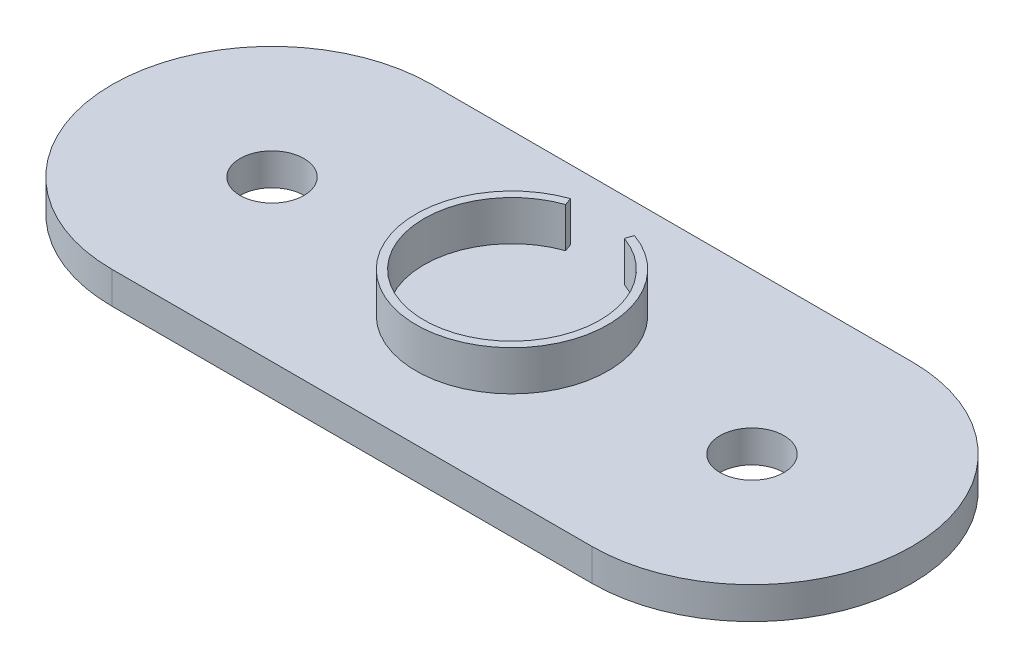
ISO-10303-21;
HEADER;
FILE_DESCRIPTION(('STEP AP214'),'2;1');
FILE_NAME('part.step','',(''),(''),'','','');
FILE_SCHEMA(('AUTOMOTIVE_DESIGN { 1 0 10303 214 1 1 1 1 }'));
ENDSEC;
DATA;
#1=APPLICATION_CONTEXT('core data for automotive mechanical design processes');
#2=APPLICATION_PROTOCOL_DEFINITION('international standard','automotive_design',2000,#1);
#3=PRODUCT_CONTEXT('',#1,'mechanical');
#4=PRODUCT('Part','Part','',(#3));
#5=PRODUCT_RELATED_PRODUCT_CATEGORY('part','',(#4));
#6=PRODUCT_DEFINITION_FORMATION('','',#4);
#7=PRODUCT_DEFINITION_CONTEXT('part definition',#1,'design');
#8=PRODUCT_DEFINITION('design','',#6,#7);
#9=PRODUCT_DEFINITION_SHAPE('','',#8);
#10=(LENGTH_UNIT() NAMED_UNIT(*) SI_UNIT(.MILLI.,.METRE.));
#11=(NAMED_UNIT(*) PLANE_ANGLE_UNIT() SI_UNIT($,.RADIAN.));
#12=(NAMED_UNIT(*) SI_UNIT($,.STERADIAN.) SOLID_ANGLE_UNIT());
#13=UNCERTAINTY_MEASURE_WITH_UNIT(LENGTH_MEASURE(1.E-05),#10,'distance_accuracy_value','');
#14=(GEOMETRIC_REPRESENTATION_CONTEXT(3) GLOBAL_UNCERTAINTY_ASSIGNED_CONTEXT((#13)) GLOBAL_UNIT_ASSIGNED_CONTEXT((#10,
#11,#12)) REPRESENTATION_CONTEXT('',''));
#15=CARTESIAN_POINT('',(0.,0.,0.));
#16=DIRECTION('',(0.,0.,1.));
#17=DIRECTION('',(1.,0.,0.));
#18=AXIS2_PLACEMENT_3D('',#15,#16,#17);
#19=CARTESIAN_POINT('',(15.,4.5,0.));
#20=DIRECTION('',(0.,1.,0.));
#21=DIRECTION('',(0.,0.,1.));
#22=AXIS2_PLACEMENT_3D('',#19,#20,#21);
#23=PLANE('',#22);
#24=CARTESIAN_POINT('',(15.,4.5,0.));
#25=DIRECTION('',(0.,1.,0.));
#26=DIRECTION('',(0.,0.,1.));
#27=AXIS2_PLACEMENT_3D('',#24,#25,#26);
#28=CIRCLE('',#27,6.);
#29=CARTESIAN_POINT('',(13.,4.5,-5.65685424949238));
#30=VERTEX_POINT('',#29);
#31=CARTESIAN_POINT('',(17.,4.5,-5.65685424949238));
#32=VERTEX_POINT('',#31);
#33=EDGE_CURVE('E127',#30,#32,#28,.T.);
#34=ORIENTED_EDGE('',*,*,#33,.T.);
#35=DIRECTION('',(0.333333333333334,0.,-0.942809041582063));
#36=VECTOR('',#35,1.);
#37=CARTESIAN_POINT('',(15.,4.5,0.));
#38=LINE('',#37,#36);
#39=CARTESIAN_POINT('',(16.8333333333333,4.5,-5.18544972870134));
#40=VERTEX_POINT('',#39);
#41=EDGE_CURVE('E110',#40,#32,#38,.T.);
#42=ORIENTED_EDGE('',*,*,#41,.F.);
#43=CARTESIAN_POINT('',(15.,4.5,0.));
#44=DIRECTION('',(0.,1.,0.));
#45=DIRECTION('',(0.,0.,1.));
#46=AXIS2_PLACEMENT_3D('',#43,#44,#45);
#47=CIRCLE('',#46,5.5);
#48=CARTESIAN_POINT('',(13.1666666666667,4.5,-5.18544972870134));
#49=VERTEX_POINT('',#48);
#50=EDGE_CURVE('E138',#49,#40,#47,.T.);
#51=ORIENTED_EDGE('',*,*,#50,.F.);
#52=DIRECTION('',(0.333333333333333,0.,0.942809041582063));
#53=VECTOR('',#52,1.);
#54=CARTESIAN_POINT('',(15.,4.5,0.));
#55=LINE('',#54,#53);
#56=EDGE_CURVE('E121',#30,#49,#55,.T.);
#57=ORIENTED_EDGE('',*,*,#56,.F.);
#58=EDGE_LOOP('',(#34,#42,#51,#57));
#59=FACE_BOUND('',#58,.T.);
#60=ADVANCED_FACE('F34',(#59),#23,.T.);
#61=CARTESIAN_POINT('',(15.,4.5,0.));
#62=DIRECTION('',(0.,-1.,0.));
#63=DIRECTION('',(0.,0.,-1.));
#64=AXIS2_PLACEMENT_3D('',#61,#62,#63);
#65=CYLINDRICAL_SURFACE('',#64,6.);
#66=DIRECTION('',(0.,-1.,0.));
#67=VECTOR('',#66,1.);
#68=CARTESIAN_POINT('',(17.,4.5,-5.65685424949238));
#69=LINE('',#68,#67);
#70=CARTESIAN_POINT('',(17.,2.,-5.65685424949238));
#71=VERTEX_POINT('',#70);
#72=EDGE_CURVE('E113',#32,#71,#69,.T.);
#73=ORIENTED_EDGE('',*,*,#72,.F.);
#74=ORIENTED_EDGE('',*,*,#33,.F.);
#75=DIRECTION('',(0.,-1.,0.));
#76=VECTOR('',#75,1.);
#77=CARTESIAN_POINT('',(13.,4.5,-5.65685424949238));
#78=LINE('',#77,#76);
#79=CARTESIAN_POINT('',(13.,2.,-5.65685424949238));
#80=VERTEX_POINT('',#79);
#81=EDGE_CURVE('E130',#30,#80,#78,.T.);
#82=ORIENTED_EDGE('',*,*,#81,.T.);
#83=CARTESIAN_POINT('',(15.,2.,0.));
#84=DIRECTION('',(0.,1.,0.));
#85=DIRECTION('',(0.,0.,1.));
#86=AXIS2_PLACEMENT_3D('',#83,#84,#85);
#87=CIRCLE('',#86,6.);
#88=EDGE_CURVE('E128',#80,#71,#87,.T.);
#89=ORIENTED_EDGE('',*,*,#88,.T.);
#90=EDGE_LOOP('',(#73,#74,#82,#89));
#91=FACE_BOUND('',#90,.T.);
#92=ADVANCED_FACE('F125',(#91),#65,.T.);
#93=CARTESIAN_POINT('',(15.,4.5,0.));
#94=DIRECTION('',(0.,-1.,0.));
#95=DIRECTION('',(0.,0.,-1.));
#96=AXIS2_PLACEMENT_3D('',#93,#94,#95);
#97=CYLINDRICAL_SURFACE('',#96,5.5);
#98=ORIENTED_EDGE('',*,*,#50,.T.);
#99=DIRECTION('',(0.,-1.,0.));
#100=VECTOR('',#99,1.);
#101=CARTESIAN_POINT('',(16.8333333333333,4.5,-5.18544972870134));
#102=LINE('',#101,#100);
#103=CARTESIAN_POINT('',(16.8333333333333,2.,-5.18544972870134));
#104=VERTEX_POINT('',#103);
#105=EDGE_CURVE('E116',#40,#104,#102,.T.);
#106=ORIENTED_EDGE('',*,*,#105,.T.);
#107=CARTESIAN_POINT('',(15.,2.,0.));
#108=DIRECTION('',(0.,1.,0.));
#109=DIRECTION('',(0.,0.,1.));
#110=AXIS2_PLACEMENT_3D('',#107,#108,#109);
#111=CIRCLE('',#110,5.5);
#112=CARTESIAN_POINT('',(13.1666666666667,2.,-5.18544972870134));
#113=VERTEX_POINT('',#112);
#114=EDGE_CURVE('E11',#104,#113,#111,.F.);
#115=ORIENTED_EDGE('',*,*,#114,.T.);
#116=DIRECTION('',(0.,-1.,0.));
#117=VECTOR('',#116,1.);
#118=CARTESIAN_POINT('',(13.1666666666667,4.5,-5.18544972870134));
#119=LINE('',#118,#117);
#120=EDGE_CURVE('E129',#113,#49,#119,.F.);
#121=ORIENTED_EDGE('',*,*,#120,.T.);
#122=EDGE_LOOP('',(#98,#106,#115,#121));
#123=FACE_BOUND('',#122,.T.);
#124=ADVANCED_FACE('F202',(#123),#97,.F.);
#125=CARTESIAN_POINT('',(0.,2.,0.));
#126=DIRECTION('',(0.,-1.,0.));
#127=DIRECTION('',(0.,0.,-1.));
#128=AXIS2_PLACEMENT_3D('',#125,#126,#127);
#129=CYLINDRICAL_SURFACE('',#128,10.);
#130=CARTESIAN_POINT('',(0.,0.,0.));
#131=DIRECTION('',(0.,1.,0.));
#132=DIRECTION('',(0.,0.,1.));
#133=AXIS2_PLACEMENT_3D('',#130,#131,#132);
#134=CIRCLE('',#133,10.);
#135=CARTESIAN_POINT('',(0.,0.,-10.));
#136=VERTEX_POINT('',#135);
#137=CARTESIAN_POINT('',(0.,0.,10.));
#138=VERTEX_POINT('',#137);
#139=EDGE_CURVE('E146',#136,#138,#134,.T.);
#140=ORIENTED_EDGE('',*,*,#139,.T.);
#141=DIRECTION('',(0.,-1.,0.));
#142=VECTOR('',#141,1.);
#143=CARTESIAN_POINT('',(0.,2.,10.));
#144=LINE('',#143,#142);
#145=CARTESIAN_POINT('',(0.,2.,10.));
#146=VERTEX_POINT('',#145);
#147=EDGE_CURVE('E42',#146,#138,#144,.T.);
#148=ORIENTED_EDGE('',*,*,#147,.F.);
#149=CARTESIAN_POINT('',(0.,2.,0.));
#150=DIRECTION('',(0.,1.,0.));
#151=DIRECTION('',(0.,0.,1.));
#152=AXIS2_PLACEMENT_3D('',#149,#150,#151);
#153=CIRCLE('',#152,10.);
#154=CARTESIAN_POINT('',(0.,2.,-10.));
#155=VERTEX_POINT('',#154);
#156=EDGE_CURVE('E152',#155,#146,#153,.T.);
#157=ORIENTED_EDGE('',*,*,#156,.F.);
#158=DIRECTION('',(0.,-1.,0.));
#159=VECTOR('',#158,1.);
#160=CARTESIAN_POINT('',(0.,2.,-10.));
#161=LINE('',#160,#159);
#162=EDGE_CURVE('E158',#155,#136,#161,.T.);
#163=ORIENTED_EDGE('',*,*,#162,.T.);
#164=EDGE_LOOP('',(#140,#148,#157,#163));
#165=FACE_BOUND('',#164,.T.);
#166=ADVANCED_FACE('F36',(#165),#129,.T.);
#167=CARTESIAN_POINT('',(0.,2.,10.));
#168=DIRECTION('',(0.,0.,-1.));
#169=DIRECTION('',(-1.,0.,0.));
#170=AXIS2_PLACEMENT_3D('',#167,#168,#169);
#171=PLANE('',#170);
#172=DIRECTION('',(1.,0.,0.));
#173=VECTOR('',#172,1.);
#174=CARTESIAN_POINT('',(0.,0.,10.));
#175=LINE('',#174,#173);
#176=CARTESIAN_POINT('',(30.,0.,10.));
#177=VERTEX_POINT('',#176);
#178=EDGE_CURVE('E161',#138,#177,#175,.T.);
#179=ORIENTED_EDGE('',*,*,#178,.T.);
#180=DIRECTION('',(0.,-1.,0.));
#181=VECTOR('',#180,1.);
#182=CARTESIAN_POINT('',(30.,2.,10.));
#183=LINE('',#182,#181);
#184=CARTESIAN_POINT('',(30.,2.,10.));
#185=VERTEX_POINT('',#184);
#186=EDGE_CURVE('E169',#185,#177,#183,.T.);
#187=ORIENTED_EDGE('',*,*,#186,.F.);
#188=DIRECTION('',(1.,0.,0.));
#189=VECTOR('',#188,1.);
#190=CARTESIAN_POINT('',(0.,2.,10.));
#191=LINE('',#190,#189);
#192=EDGE_CURVE('E87',#146,#185,#191,.T.);
#193=ORIENTED_EDGE('',*,*,#192,.F.);
#194=ORIENTED_EDGE('',*,*,#147,.T.);
#195=EDGE_LOOP('',(#179,#187,#193,#194));
#196=FACE_BOUND('',#195,.T.);
#197=ADVANCED_FACE('F172',(#196),#171,.F.);
#198=CARTESIAN_POINT('',(30.,2.,0.));
#199=DIRECTION('',(0.,-1.,0.));
#200=DIRECTION('',(0.,0.,-1.));
#201=AXIS2_PLACEMENT_3D('',#198,#199,#200);
#202=CYLINDRICAL_SURFACE('',#201,10.);
#203=CARTESIAN_POINT('',(30.,0.,0.));
#204=DIRECTION('',(0.,1.,0.));
#205=DIRECTION('',(0.,0.,1.));
#206=AXIS2_PLACEMENT_3D('',#203,#204,#205);
#207=CIRCLE('',#206,10.);
#208=CARTESIAN_POINT('',(30.,0.,-10.));
#209=VERTEX_POINT('',#208);
#210=EDGE_CURVE('E163',#177,#209,#207,.T.);
#211=ORIENTED_EDGE('',*,*,#210,.T.);
#212=DIRECTION('',(0.,-1.,0.));
#213=VECTOR('',#212,1.);
#214=CARTESIAN_POINT('',(30.,2.,-10.));
#215=LINE('',#214,#213);
#216=CARTESIAN_POINT('',(30.,2.,-10.));
#217=VERTEX_POINT('',#216);
#218=EDGE_CURVE('E167',#217,#209,#215,.T.);
#219=ORIENTED_EDGE('',*,*,#218,.F.);
#220=CARTESIAN_POINT('',(30.,2.,0.));
#221=DIRECTION('',(0.,1.,0.));
#222=DIRECTION('',(0.,0.,1.));
#223=AXIS2_PLACEMENT_3D('',#220,#221,#222);
#224=CIRCLE('',#223,10.);
#225=EDGE_CURVE('E155',#185,#217,#224,.T.);
#226=ORIENTED_EDGE('',*,*,#225,.F.);
#227=ORIENTED_EDGE('',*,*,#186,.T.);
#228=EDGE_LOOP('',(#211,#219,#226,#227));
#229=FACE_BOUND('',#228,.T.);
#230=ADVANCED_FACE('F181',(#229),#202,.T.);
#231=CARTESIAN_POINT('',(0.,2.,-10.));
#232=DIRECTION('',(0.,0.,1.));
#233=DIRECTION('',(1.,0.,0.));
#234=AXIS2_PLACEMENT_3D('',#231,#232,#233);
#235=PLANE('',#234);
#236=DIRECTION('',(-1.,0.,0.));
#237=VECTOR('',#236,1.);
#238=CARTESIAN_POINT('',(0.,0.,-10.));
#239=LINE('',#238,#237);
#240=EDGE_CURVE('E79',#209,#136,#239,.T.);
#241=ORIENTED_EDGE('',*,*,#240,.T.);
#242=ORIENTED_EDGE('',*,*,#162,.F.);
#243=DIRECTION('',(-1.,0.,0.));
#244=VECTOR('',#243,1.);
#245=CARTESIAN_POINT('',(0.,2.,-10.));
#246=LINE('',#245,#244);
#247=EDGE_CURVE('E58',#217,#155,#246,.T.);
#248=ORIENTED_EDGE('',*,*,#247,.F.);
#249=ORIENTED_EDGE('',*,*,#218,.T.);
#250=EDGE_LOOP('',(#241,#242,#248,#249));
#251=FACE_BOUND('',#250,.T.);
#252=ADVANCED_FACE('F183',(#251),#235,.F.);
#253=CARTESIAN_POINT('',(0.,2.,0.));
#254=DIRECTION('',(0.,1.,0.));
#255=DIRECTION('',(0.,0.,1.));
#256=AXIS2_PLACEMENT_3D('',#253,#254,#255);
#257=PLANE('',#256);
#258=ORIENTED_EDGE('',*,*,#88,.F.);
#259=DIRECTION('',(0.333333333333333,0.,0.942809041582063));
#260=VECTOR('',#259,1.);
#261=CARTESIAN_POINT('',(15.,2.,0.));
#262=LINE('',#261,#260);
#263=EDGE_CURVE('E49',#80,#113,#262,.T.);
#264=ORIENTED_EDGE('',*,*,#263,.T.);
#265=ORIENTED_EDGE('',*,*,#114,.F.);
#266=DIRECTION('',(0.333333333333334,0.,-0.942809041582063));
#267=VECTOR('',#266,1.);
#268=CARTESIAN_POINT('',(15.,2.,0.));
#269=LINE('',#268,#267);
#270=EDGE_CURVE('E310',#104,#71,#269,.T.);
#271=ORIENTED_EDGE('',*,*,#270,.T.);
#272=EDGE_LOOP('',(#258,#264,#265,#271));
#273=FACE_BOUND('',#272,.T.);
#274=CARTESIAN_POINT('',(0.,2.,0.));
#275=DIRECTION('',(0.,1.,0.));
#276=DIRECTION('',(0.,0.,1.));
#277=AXIS2_PLACEMENT_3D('',#274,#275,#276);
#278=CIRCLE('',#277,2.);
#279=CARTESIAN_POINT('',(0.,2.,2.));
#280=VERTEX_POINT('',#279);
#281=EDGE_CURVE('E147',#280,#280,#278,.T.);
#282=ORIENTED_EDGE('',*,*,#281,.F.);
#283=EDGE_LOOP('',(#282));
#284=FACE_BOUND('',#283,.T.);
#285=CARTESIAN_POINT('',(30.,2.,0.));
#286=DIRECTION('',(0.,1.,0.));
#287=DIRECTION('',(0.,0.,1.));
#288=AXIS2_PLACEMENT_3D('',#285,#286,#287);
#289=CIRCLE('',#288,2.);
#290=CARTESIAN_POINT('',(30.,2.,2.));
#291=VERTEX_POINT('',#290);
#292=EDGE_CURVE('E133',#291,#291,#289,.T.);
#293=ORIENTED_EDGE('',*,*,#292,.F.);
#294=EDGE_LOOP('',(#293));
#295=FACE_BOUND('',#294,.T.);
#296=ORIENTED_EDGE('',*,*,#156,.T.);
#297=ORIENTED_EDGE('',*,*,#192,.T.);
#298=ORIENTED_EDGE('',*,*,#225,.T.);
#299=ORIENTED_EDGE('',*,*,#247,.T.);
#300=EDGE_LOOP('',(#296,#297,#298,#299));
#301=FACE_BOUND('',#300,.T.);
#302=ADVANCED_FACE('F184',(#273,#284,#295,#301),#257,.T.);
#303=CARTESIAN_POINT('',(0.,0.,0.));
#304=DIRECTION('',(0.,1.,0.));
#305=DIRECTION('',(0.,0.,1.));
#306=AXIS2_PLACEMENT_3D('',#303,#304,#305);
#307=PLANE('',#306);
#308=CARTESIAN_POINT('',(0.,0.,0.));
#309=DIRECTION('',(0.,1.,0.));
#310=DIRECTION('',(0.,0.,1.));
#311=AXIS2_PLACEMENT_3D('',#308,#309,#310);
#312=CIRCLE('',#311,2.);
#313=CARTESIAN_POINT('',(0.,0.,2.));
#314=VERTEX_POINT('',#313);
#315=EDGE_CURVE('E143',#314,#314,#312,.T.);
#316=ORIENTED_EDGE('',*,*,#315,.T.);
#317=EDGE_LOOP('',(#316));
#318=FACE_BOUND('',#317,.T.);
#319=CARTESIAN_POINT('',(30.,0.,0.));
#320=DIRECTION('',(0.,1.,0.));
#321=DIRECTION('',(0.,0.,1.));
#322=AXIS2_PLACEMENT_3D('',#319,#320,#321);
#323=CIRCLE('',#322,2.);
#324=CARTESIAN_POINT('',(30.,0.,2.));
#325=VERTEX_POINT('',#324);
#326=EDGE_CURVE('E136',#325,#325,#323,.T.);
#327=ORIENTED_EDGE('',*,*,#326,.T.);
#328=EDGE_LOOP('',(#327));
#329=FACE_BOUND('',#328,.T.);
#330=ORIENTED_EDGE('',*,*,#139,.F.);
#331=ORIENTED_EDGE('',*,*,#240,.F.);
#332=ORIENTED_EDGE('',*,*,#210,.F.);
#333=ORIENTED_EDGE('',*,*,#178,.F.);
#334=EDGE_LOOP('',(#330,#331,#332,#333));
#335=FACE_BOUND('',#334,.T.);
#336=ADVANCED_FACE('F177',(#318,#329,#335),#307,.F.);
#337=CARTESIAN_POINT('',(30.,0.,0.));
#338=DIRECTION('',(0.,1.,0.));
#339=DIRECTION('',(0.,0.,1.));
#340=AXIS2_PLACEMENT_3D('',#337,#338,#339);
#341=CYLINDRICAL_SURFACE('',#340,2.);
#342=ORIENTED_EDGE('',*,*,#326,.F.);
#343=EDGE_LOOP('',(#342));
#344=FACE_BOUND('',#343,.T.);
#345=ORIENTED_EDGE('',*,*,#292,.T.);
#346=EDGE_LOOP('',(#345));
#347=FACE_BOUND('',#346,.T.);
#348=ADVANCED_FACE('F191',(#344,#347),#341,.F.);
#349=CARTESIAN_POINT('',(0.,0.,0.));
#350=DIRECTION('',(0.,1.,0.));
#351=DIRECTION('',(0.,0.,1.));
#352=AXIS2_PLACEMENT_3D('',#349,#350,#351);
#353=CYLINDRICAL_SURFACE('',#352,2.);
#354=ORIENTED_EDGE('',*,*,#315,.F.);
#355=EDGE_LOOP('',(#354));
#356=FACE_BOUND('',#355,.T.);
#357=ORIENTED_EDGE('',*,*,#281,.T.);
#358=EDGE_LOOP('',(#357));
#359=FACE_BOUND('',#358,.T.);
#360=ADVANCED_FACE('F207',(#356,#359),#353,.F.);
#361=CARTESIAN_POINT('',(15.,4.5,0.));
#362=DIRECTION('',(-0.942809041582063,0.,-0.333333333333334));
#363=DIRECTION('',(-0.333333333333334,0.,0.942809041582063));
#364=AXIS2_PLACEMENT_3D('',#361,#362,#363);
#365=PLANE('',#364);
#366=ORIENTED_EDGE('',*,*,#41,.T.);
#367=ORIENTED_EDGE('',*,*,#72,.T.);
#368=ORIENTED_EDGE('',*,*,#270,.F.);
#369=ORIENTED_EDGE('',*,*,#105,.F.);
#370=EDGE_LOOP('',(#366,#367,#368,#369));
#371=FACE_BOUND('',#370,.T.);
#372=ADVANCED_FACE('F112',(#371),#365,.T.);
#373=CARTESIAN_POINT('',(15.,4.5,0.));
#374=DIRECTION('',(0.942809041582063,0.,-0.333333333333333));
#375=DIRECTION('',(-0.333333333333333,0.,-0.942809041582063));
#376=AXIS2_PLACEMENT_3D('',#373,#374,#375);
#377=PLANE('',#376);
#378=ORIENTED_EDGE('',*,*,#263,.F.);
#379=ORIENTED_EDGE('',*,*,#81,.F.);
#380=ORIENTED_EDGE('',*,*,#56,.T.);
#381=ORIENTED_EDGE('',*,*,#120,.F.);
#382=EDGE_LOOP('',(#378,#379,#380,#381));
#383=FACE_BOUND('',#382,.T.);
#384=ADVANCED_FACE('F231',(#383),#377,.T.);
#385=CLOSED_SHELL('',(#60,#92,#124,#166,#197,#230,#252,#302,#336,#348,#360,#372,#384));
#386=MANIFOLD_SOLID_BREP('B2',#385);
#387=ADVANCED_BREP_SHAPE_REPRESENTATION('',(#18,#386),#14);
#388=SHAPE_DEFINITION_REPRESENTATION(#9,#387);
ENDSEC;
END-ISO-10303-21;
